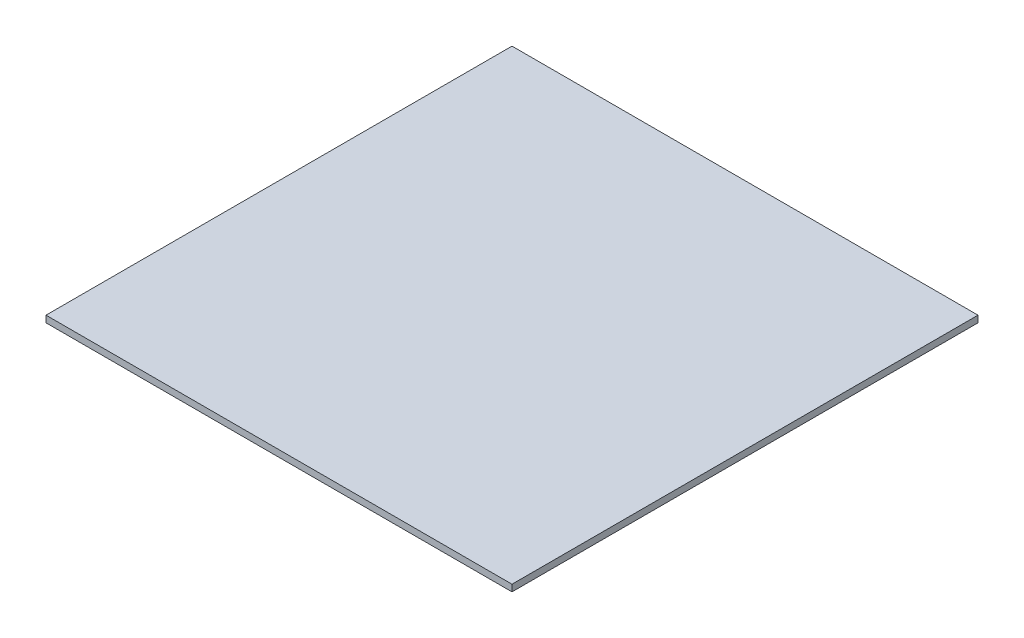
ISO-10303-21;
HEADER;
FILE_DESCRIPTION(('STEP AP214'),'2;1');
FILE_NAME('part.step','',(''),(''),'','','');
FILE_SCHEMA(('AUTOMOTIVE_DESIGN { 1 0 10303 214 1 1 1 1 }'));
ENDSEC;
DATA;
#1=APPLICATION_CONTEXT('core data for automotive mechanical design processes');
#2=APPLICATION_PROTOCOL_DEFINITION('international standard','automotive_design',2000,#1);
#3=PRODUCT_CONTEXT('',#1,'mechanical');
#4=PRODUCT('Part','Part','',(#3));
#5=PRODUCT_RELATED_PRODUCT_CATEGORY('part','',(#4));
#6=PRODUCT_DEFINITION_FORMATION('','',#4);
#7=PRODUCT_DEFINITION_CONTEXT('part definition',#1,'design');
#8=PRODUCT_DEFINITION('design','',#6,#7);
#9=PRODUCT_DEFINITION_SHAPE('','',#8);
#10=(LENGTH_UNIT() NAMED_UNIT(*) SI_UNIT(.MILLI.,.METRE.));
#11=(NAMED_UNIT(*) PLANE_ANGLE_UNIT() SI_UNIT($,.RADIAN.));
#12=(NAMED_UNIT(*) SI_UNIT($,.STERADIAN.) SOLID_ANGLE_UNIT());
#13=UNCERTAINTY_MEASURE_WITH_UNIT(LENGTH_MEASURE(1.E-05),#10,'distance_accuracy_value','');
#14=(GEOMETRIC_REPRESENTATION_CONTEXT(3) GLOBAL_UNCERTAINTY_ASSIGNED_CONTEXT((#13)) GLOBAL_UNIT_ASSIGNED_CONTEXT((#10,
#11,#12)) REPRESENTATION_CONTEXT('',''));
#15=CARTESIAN_POINT('',(0.,0.,0.));
#16=DIRECTION('',(0.,0.,1.));
#17=DIRECTION('',(1.,0.,0.));
#18=AXIS2_PLACEMENT_3D('',#15,#16,#17);
#19=CARTESIAN_POINT('',(-36.4347127830273,4.,-237.00168087003));
#20=DIRECTION('',(1.,0.,0.));
#21=DIRECTION('',(0.,0.,-1.));
#22=AXIS2_PLACEMENT_3D('',#19,#20,#21);
#23=PLANE('',#22);
#24=DIRECTION('',(0.,0.,1.));
#25=VECTOR('',#24,1.);
#26=CARTESIAN_POINT('',(-36.4347127830273,0.,-237.00168087003));
#27=LINE('',#26,#25);
#28=CARTESIAN_POINT('',(-36.4347127830273,0.,-237.00168087003));
#29=VERTEX_POINT('',#28);
#30=CARTESIAN_POINT('',(-36.4347127830273,0.,42.9983191299697));
#31=VERTEX_POINT('',#30);
#32=EDGE_CURVE('E96',#29,#31,#27,.T.);
#33=ORIENTED_EDGE('',*,*,#32,.T.);
#34=DIRECTION('',(0.,-1.,0.));
#35=VECTOR('',#34,1.);
#36=CARTESIAN_POINT('',(-36.4347127830273,4.,42.9983191299697));
#37=LINE('',#36,#35);
#38=CARTESIAN_POINT('',(-36.4347127830273,4.,42.9983191299697));
#39=VERTEX_POINT('',#38);
#40=EDGE_CURVE('E11',#39,#31,#37,.T.);
#41=ORIENTED_EDGE('',*,*,#40,.F.);
#42=DIRECTION('',(0.,0.,1.));
#43=VECTOR('',#42,1.);
#44=CARTESIAN_POINT('',(-36.4347127830273,4.,-237.00168087003));
#45=LINE('',#44,#43);
#46=CARTESIAN_POINT('',(-36.4347127830273,4.,-237.00168087003));
#47=VERTEX_POINT('',#46);
#48=EDGE_CURVE('E84',#47,#39,#45,.T.);
#49=ORIENTED_EDGE('',*,*,#48,.F.);
#50=DIRECTION('',(0.,-1.,0.));
#51=VECTOR('',#50,1.);
#52=CARTESIAN_POINT('',(-36.4347127830273,4.,-237.00168087003));
#53=LINE('',#52,#51);
#54=EDGE_CURVE('E92',#47,#29,#53,.T.);
#55=ORIENTED_EDGE('',*,*,#54,.T.);
#56=EDGE_LOOP('',(#33,#41,#49,#55));
#57=FACE_BOUND('',#56,.T.);
#58=ADVANCED_FACE('F33',(#57),#23,.F.);
#59=CARTESIAN_POINT('',(-36.4347127830273,4.,42.9983191299697));
#60=DIRECTION('',(0.,0.,-1.));
#61=DIRECTION('',(-1.,0.,0.));
#62=AXIS2_PLACEMENT_3D('',#59,#60,#61);
#63=PLANE('',#62);
#64=DIRECTION('',(1.,0.,0.));
#65=VECTOR('',#64,1.);
#66=CARTESIAN_POINT('',(-36.4347127830273,0.,42.9983191299697));
#67=LINE('',#66,#65);
#68=CARTESIAN_POINT('',(243.565287216973,0.,42.9983191299697));
#69=VERTEX_POINT('',#68);
#70=EDGE_CURVE('E88',#31,#69,#67,.T.);
#71=ORIENTED_EDGE('',*,*,#70,.T.);
#72=DIRECTION('',(0.,-1.,0.));
#73=VECTOR('',#72,1.);
#74=CARTESIAN_POINT('',(243.565287216973,4.,42.9983191299697));
#75=LINE('',#74,#73);
#76=CARTESIAN_POINT('',(243.565287216973,4.,42.9983191299697));
#77=VERTEX_POINT('',#76);
#78=EDGE_CURVE('E41',#77,#69,#75,.T.);
#79=ORIENTED_EDGE('',*,*,#78,.F.);
#80=DIRECTION('',(1.,0.,0.));
#81=VECTOR('',#80,1.);
#82=CARTESIAN_POINT('',(-36.4347127830273,4.,42.9983191299697));
#83=LINE('',#82,#81);
#84=EDGE_CURVE('E79',#39,#77,#83,.T.);
#85=ORIENTED_EDGE('',*,*,#84,.F.);
#86=ORIENTED_EDGE('',*,*,#40,.T.);
#87=EDGE_LOOP('',(#71,#79,#85,#86));
#88=FACE_BOUND('',#87,.T.);
#89=ADVANCED_FACE('F87',(#88),#63,.F.);
#90=CARTESIAN_POINT('',(243.565287216973,4.,-237.00168087003));
#91=DIRECTION('',(-1.,0.,0.));
#92=DIRECTION('',(0.,0.,1.));
#93=AXIS2_PLACEMENT_3D('',#90,#91,#92);
#94=PLANE('',#93);
#95=DIRECTION('',(0.,0.,-1.));
#96=VECTOR('',#95,1.);
#97=CARTESIAN_POINT('',(243.565287216973,0.,-237.00168087003));
#98=LINE('',#97,#96);
#99=CARTESIAN_POINT('',(243.565287216973,0.,-237.00168087003));
#100=VERTEX_POINT('',#99);
#101=EDGE_CURVE('E66',#69,#100,#98,.T.);
#102=ORIENTED_EDGE('',*,*,#101,.T.);
#103=DIRECTION('',(0.,-1.,0.));
#104=VECTOR('',#103,1.);
#105=CARTESIAN_POINT('',(243.565287216973,4.,-237.00168087003));
#106=LINE('',#105,#104);
#107=CARTESIAN_POINT('',(243.565287216973,4.,-237.00168087003));
#108=VERTEX_POINT('',#107);
#109=EDGE_CURVE('E89',#108,#100,#106,.T.);
#110=ORIENTED_EDGE('',*,*,#109,.F.);
#111=DIRECTION('',(0.,0.,-1.));
#112=VECTOR('',#111,1.);
#113=CARTESIAN_POINT('',(243.565287216973,4.,-237.00168087003));
#114=LINE('',#113,#112);
#115=EDGE_CURVE('E82',#77,#108,#114,.T.);
#116=ORIENTED_EDGE('',*,*,#115,.F.);
#117=ORIENTED_EDGE('',*,*,#78,.T.);
#118=EDGE_LOOP('',(#102,#110,#116,#117));
#119=FACE_BOUND('',#118,.T.);
#120=ADVANCED_FACE('F90',(#119),#94,.F.);
#121=CARTESIAN_POINT('',(-36.4347127830273,4.,-237.00168087003));
#122=DIRECTION('',(0.,0.,1.));
#123=DIRECTION('',(1.,0.,0.));
#124=AXIS2_PLACEMENT_3D('',#121,#122,#123);
#125=PLANE('',#124);
#126=DIRECTION('',(-1.,0.,0.));
#127=VECTOR('',#126,1.);
#128=CARTESIAN_POINT('',(-36.4347127830273,0.,-237.00168087003));
#129=LINE('',#128,#127);
#130=EDGE_CURVE('E72',#100,#29,#129,.T.);
#131=ORIENTED_EDGE('',*,*,#130,.T.);
#132=ORIENTED_EDGE('',*,*,#54,.F.);
#133=DIRECTION('',(-1.,0.,0.));
#134=VECTOR('',#133,1.);
#135=CARTESIAN_POINT('',(-36.4347127830273,4.,-237.00168087003));
#136=LINE('',#135,#134);
#137=EDGE_CURVE('E49',#108,#47,#136,.T.);
#138=ORIENTED_EDGE('',*,*,#137,.F.);
#139=ORIENTED_EDGE('',*,*,#109,.T.);
#140=EDGE_LOOP('',(#131,#132,#138,#139));
#141=FACE_BOUND('',#140,.T.);
#142=ADVANCED_FACE('F103',(#141),#125,.F.);
#143=CARTESIAN_POINT('',(0.,4.,0.));
#144=DIRECTION('',(0.,1.,0.));
#145=DIRECTION('',(0.,0.,1.));
#146=AXIS2_PLACEMENT_3D('',#143,#144,#145);
#147=PLANE('',#146);
#148=ORIENTED_EDGE('',*,*,#48,.T.);
#149=ORIENTED_EDGE('',*,*,#84,.T.);
#150=ORIENTED_EDGE('',*,*,#115,.T.);
#151=ORIENTED_EDGE('',*,*,#137,.T.);
#152=EDGE_LOOP('',(#148,#149,#150,#151));
#153=FACE_BOUND('',#152,.T.);
#154=ADVANCED_FACE('F80',(#153),#147,.T.);
#155=CARTESIAN_POINT('',(0.,0.,0.));
#156=DIRECTION('',(0.,1.,0.));
#157=DIRECTION('',(0.,0.,1.));
#158=AXIS2_PLACEMENT_3D('',#155,#156,#157);
#159=PLANE('',#158);
#160=ORIENTED_EDGE('',*,*,#32,.F.);
#161=ORIENTED_EDGE('',*,*,#130,.F.);
#162=ORIENTED_EDGE('',*,*,#101,.F.);
#163=ORIENTED_EDGE('',*,*,#70,.F.);
#164=EDGE_LOOP('',(#160,#161,#162,#163));
#165=FACE_BOUND('',#164,.T.);
#166=ADVANCED_FACE('F106',(#165),#159,.F.);
#167=CLOSED_SHELL('',(#58,#89,#120,#142,#154,#166));
#168=MANIFOLD_SOLID_BREP('B2',#167);
#169=ADVANCED_BREP_SHAPE_REPRESENTATION('',(#18,#168),#14);
#170=SHAPE_DEFINITION_REPRESENTATION(#9,#169);
ENDSEC;
END-ISO-10303-21;
